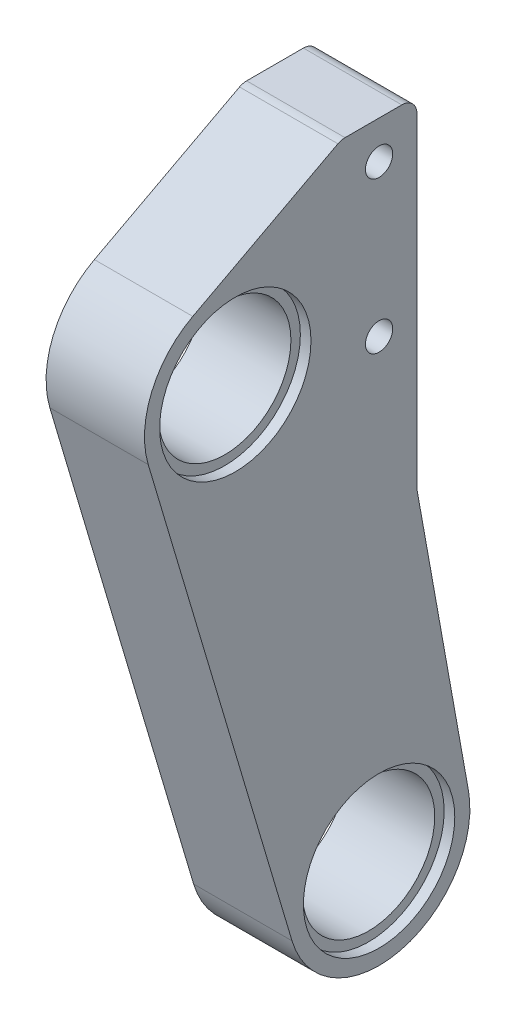
ISO-10303-21;
HEADER;
FILE_DESCRIPTION(('STEP AP214'),'2;1');
FILE_NAME('part.step','',(''),(''),'','','');
FILE_SCHEMA(('AUTOMOTIVE_DESIGN { 1 0 10303 214 1 1 1 1 }'));
ENDSEC;
DATA;
#1=APPLICATION_CONTEXT('core data for automotive mechanical design processes');
#2=APPLICATION_PROTOCOL_DEFINITION('international standard','automotive_design',2000,#1);
#3=PRODUCT_CONTEXT('',#1,'mechanical');
#4=PRODUCT('Part','Part','',(#3));
#5=PRODUCT_RELATED_PRODUCT_CATEGORY('part','',(#4));
#6=PRODUCT_DEFINITION_FORMATION('','',#4);
#7=PRODUCT_DEFINITION_CONTEXT('part definition',#1,'design');
#8=PRODUCT_DEFINITION('design','',#6,#7);
#9=PRODUCT_DEFINITION_SHAPE('','',#8);
#10=(LENGTH_UNIT() NAMED_UNIT(*) SI_UNIT(.MILLI.,.METRE.));
#11=(NAMED_UNIT(*) PLANE_ANGLE_UNIT() SI_UNIT($,.RADIAN.));
#12=(NAMED_UNIT(*) SI_UNIT($,.STERADIAN.) SOLID_ANGLE_UNIT());
#13=UNCERTAINTY_MEASURE_WITH_UNIT(LENGTH_MEASURE(1.E-05),#10,'distance_accuracy_value','');
#14=(GEOMETRIC_REPRESENTATION_CONTEXT(3) GLOBAL_UNCERTAINTY_ASSIGNED_CONTEXT((#13)) GLOBAL_UNIT_ASSIGNED_CONTEXT((#10,
#11,#12)) REPRESENTATION_CONTEXT('',''));
#15=CARTESIAN_POINT('',(0.,0.,0.));
#16=DIRECTION('',(0.,0.,1.));
#17=DIRECTION('',(1.,0.,0.));
#18=AXIS2_PLACEMENT_3D('',#15,#16,#17);
#19=CARTESIAN_POINT('',(16.51,5.08000000000002,24.13));
#20=DIRECTION('',(-1.,0.,0.));
#21=DIRECTION('',(0.,0.,1.));
#22=AXIS2_PLACEMENT_3D('',#19,#20,#21);
#23=CYLINDRICAL_SURFACE('',#22,11.1125);
#24=CARTESIAN_POINT('',(0.,5.08000000000002,24.13));
#25=DIRECTION('',(1.,0.,0.));
#26=DIRECTION('',(0.,0.,-1.));
#27=AXIS2_PLACEMENT_3D('',#24,#25,#26);
#28=CIRCLE('',#27,11.1125);
#29=CARTESIAN_POINT('',(0.,5.08000000000002,13.0175));
#30=VERTEX_POINT('',#29);
#31=EDGE_CURVE('E212',#30,#30,#28,.T.);
#32=ORIENTED_EDGE('',*,*,#31,.F.);
#33=EDGE_LOOP('',(#32));
#34=FACE_BOUND('',#33,.T.);
#35=CARTESIAN_POINT('',(14.732,5.08000000000002,24.13));
#36=DIRECTION('',(1.,0.,0.));
#37=DIRECTION('',(0.,0.,-1.));
#38=AXIS2_PLACEMENT_3D('',#35,#36,#37);
#39=CIRCLE('',#38,11.1125);
#40=CARTESIAN_POINT('',(14.732,5.08000000000002,13.0175));
#41=VERTEX_POINT('',#40);
#42=EDGE_CURVE('E148',#41,#41,#39,.T.);
#43=ORIENTED_EDGE('',*,*,#42,.T.);
#44=EDGE_LOOP('',(#43));
#45=FACE_BOUND('',#44,.T.);
#46=ADVANCED_FACE('F35',(#34,#45),#23,.F.);
#47=CARTESIAN_POINT('',(16.51,-76.2,0.));
#48=DIRECTION('',(-1.,0.,0.));
#49=DIRECTION('',(0.,0.,1.));
#50=AXIS2_PLACEMENT_3D('',#47,#48,#49);
#51=CYLINDRICAL_SURFACE('',#50,11.1125);
#52=CARTESIAN_POINT('',(0.,-76.2,0.));
#53=DIRECTION('',(1.,0.,0.));
#54=DIRECTION('',(0.,0.,-1.));
#55=AXIS2_PLACEMENT_3D('',#52,#53,#54);
#56=CIRCLE('',#55,11.1125);
#57=CARTESIAN_POINT('',(0.,-76.2,-11.1125));
#58=VERTEX_POINT('',#57);
#59=EDGE_CURVE('E209',#58,#58,#56,.T.);
#60=ORIENTED_EDGE('',*,*,#59,.F.);
#61=EDGE_LOOP('',(#60));
#62=FACE_BOUND('',#61,.T.);
#63=CARTESIAN_POINT('',(14.732,-76.2,0.));
#64=DIRECTION('',(1.,0.,0.));
#65=DIRECTION('',(0.,0.,-1.));
#66=AXIS2_PLACEMENT_3D('',#63,#64,#65);
#67=CIRCLE('',#66,11.1125);
#68=CARTESIAN_POINT('',(14.732,-76.2,-11.1125));
#69=VERTEX_POINT('',#68);
#70=EDGE_CURVE('E145',#69,#69,#67,.T.);
#71=ORIENTED_EDGE('',*,*,#70,.T.);
#72=EDGE_LOOP('',(#71));
#73=FACE_BOUND('',#72,.T.);
#74=ADVANCED_FACE('F289',(#62,#73),#51,.F.);
#75=CARTESIAN_POINT('',(16.51,27.415812969478,14.5286727979772));
#76=DIRECTION('',(0.,-0.883595677168671,-0.468250658610149));
#77=DIRECTION('',(0.,0.468250658610149,-0.883595677168671));
#78=AXIS2_PLACEMENT_3D('',#75,#76,#77);
#79=PLANE('',#78);
#80=DIRECTION('',(0.,-0.468250658610149,0.883595677168671));
#81=VECTOR('',#80,1.);
#82=CARTESIAN_POINT('',(16.51,27.415812969478,14.5286727979772));
#83=LINE('',#82,#81);
#84=CARTESIAN_POINT('',(16.51,31.4543330200084,6.90792781194907));
#85=VERTEX_POINT('',#84);
#86=CARTESIAN_POINT('',(16.51,18.5459981200506,31.2661400372187));
#87=VERTEX_POINT('',#86);
#88=EDGE_CURVE('E111',#85,#87,#83,.T.);
#89=ORIENTED_EDGE('',*,*,#88,.F.);
#90=DIRECTION('',(-1.,0.,0.));
#91=VECTOR('',#90,1.);
#92=CARTESIAN_POINT('',(0.,31.4543330200084,6.90792781194907));
#93=LINE('',#92,#91);
#94=CARTESIAN_POINT('',(0.,31.4543330200084,6.90792781194907));
#95=VERTEX_POINT('',#94);
#96=EDGE_CURVE('E157',#85,#95,#93,.T.);
#97=ORIENTED_EDGE('',*,*,#96,.T.);
#98=DIRECTION('',(0.,-0.468250658610149,0.883595677168671));
#99=VECTOR('',#98,1.);
#100=CARTESIAN_POINT('',(0.,27.415812969478,14.5286727979772));
#101=LINE('',#100,#99);
#102=CARTESIAN_POINT('',(0.,18.5459981200506,31.2661400372187));
#103=VERTEX_POINT('',#102);
#104=EDGE_CURVE('E135',#95,#103,#101,.T.);
#105=ORIENTED_EDGE('',*,*,#104,.T.);
#106=DIRECTION('',(-1.,0.,0.));
#107=VECTOR('',#106,1.);
#108=CARTESIAN_POINT('',(16.51,18.5459981200506,31.2661400372187));
#109=LINE('',#108,#107);
#110=EDGE_CURVE('E127',#87,#103,#109,.T.);
#111=ORIENTED_EDGE('',*,*,#110,.F.);
#112=EDGE_LOOP('',(#89,#97,#105,#111));
#113=FACE_BOUND('',#112,.T.);
#114=ADVANCED_FACE('F133',(#113),#79,.F.);
#115=CARTESIAN_POINT('',(16.51,5.08000000000002,24.13));
#116=DIRECTION('',(-1.,0.,0.));
#117=DIRECTION('',(0.,0.,1.));
#118=AXIS2_PLACEMENT_3D('',#115,#116,#117);
#119=CYLINDRICAL_SURFACE('',#118,15.24);
#120=CARTESIAN_POINT('',(0.,5.08000000000002,24.13));
#121=DIRECTION('',(1.,0.,0.));
#122=DIRECTION('',(0.,0.,-1.));
#123=AXIS2_PLACEMENT_3D('',#120,#121,#122);
#124=CIRCLE('',#123,15.24);
#125=CARTESIAN_POINT('',(0.,0.742722084383057,38.7397782420782));
#126=VERTEX_POINT('',#125);
#127=EDGE_CURVE('E216',#103,#126,#124,.T.);
#128=ORIENTED_EDGE('',*,*,#127,.T.);
#129=DIRECTION('',(-1.,0.,0.));
#130=VECTOR('',#129,1.);
#131=CARTESIAN_POINT('',(16.51,0.742722084383057,38.7397782420782));
#132=LINE('',#131,#130);
#133=CARTESIAN_POINT('',(16.51,0.742722084383057,38.7397782420782));
#134=VERTEX_POINT('',#133);
#135=EDGE_CURVE('E129',#134,#126,#132,.T.);
#136=ORIENTED_EDGE('',*,*,#135,.F.);
#137=CARTESIAN_POINT('',(16.51,5.08000000000002,24.13));
#138=DIRECTION('',(1.,0.,0.));
#139=DIRECTION('',(0.,0.,-1.));
#140=AXIS2_PLACEMENT_3D('',#137,#138,#139);
#141=CIRCLE('',#140,15.24);
#142=EDGE_CURVE('E114',#87,#134,#141,.T.);
#143=ORIENTED_EDGE('',*,*,#142,.F.);
#144=ORIENTED_EDGE('',*,*,#110,.T.);
#145=EDGE_LOOP('',(#128,#136,#143,#144));
#146=FACE_BOUND('',#145,.T.);
#147=ADVANCED_FACE('F126',(#146),#119,.T.);
#148=CARTESIAN_POINT('',(16.51,-10.5091872716861,35.3993676519952));
#149=DIRECTION('',(0.,0.28459828842631,-0.958646866278097));
#150=DIRECTION('',(0.,0.958646866278097,0.28459828842631));
#151=AXIS2_PLACEMENT_3D('',#148,#149,#150);
#152=PLANE('',#151);
#153=DIRECTION('',(0.,-0.958646866278097,-0.28459828842631));
#154=VECTOR('',#153,1.);
#155=CARTESIAN_POINT('',(0.,-10.5091872716861,35.3993676519952));
#156=LINE('',#155,#154);
#157=CARTESIAN_POINT('',(0.,-80.537277915617,14.6097782420782));
#158=VERTEX_POINT('',#157);
#159=EDGE_CURVE('E218',#126,#158,#156,.T.);
#160=ORIENTED_EDGE('',*,*,#159,.T.);
#161=DIRECTION('',(-1.,0.,0.));
#162=VECTOR('',#161,1.);
#163=CARTESIAN_POINT('',(16.51,-80.537277915617,14.6097782420782));
#164=LINE('',#163,#162);
#165=CARTESIAN_POINT('',(16.51,-80.537277915617,14.6097782420782));
#166=VERTEX_POINT('',#165);
#167=EDGE_CURVE('E141',#166,#158,#164,.T.);
#168=ORIENTED_EDGE('',*,*,#167,.F.);
#169=DIRECTION('',(0.,-0.958646866278097,-0.28459828842631));
#170=VECTOR('',#169,1.);
#171=CARTESIAN_POINT('',(16.51,-10.5091872716861,35.3993676519952));
#172=LINE('',#171,#170);
#173=EDGE_CURVE('E131',#134,#166,#172,.T.);
#174=ORIENTED_EDGE('',*,*,#173,.F.);
#175=ORIENTED_EDGE('',*,*,#135,.T.);
#176=EDGE_LOOP('',(#160,#168,#174,#175));
#177=FACE_BOUND('',#176,.T.);
#178=ADVANCED_FACE('F233',(#177),#152,.F.);
#179=CARTESIAN_POINT('',(16.51,-76.2,0.));
#180=DIRECTION('',(-1.,0.,0.));
#181=DIRECTION('',(0.,0.,1.));
#182=AXIS2_PLACEMENT_3D('',#179,#180,#181);
#183=CYLINDRICAL_SURFACE('',#182,15.24);
#184=CARTESIAN_POINT('',(0.,-76.2,0.));
#185=DIRECTION('',(1.,0.,0.));
#186=DIRECTION('',(0.,0.,-1.));
#187=AXIS2_PLACEMENT_3D('',#184,#185,#186);
#188=CIRCLE('',#187,15.24);
#189=CARTESIAN_POINT('',(0.,-73.5029309083728,-14.9994472669825));
#190=VERTEX_POINT('',#189);
#191=EDGE_CURVE('E187',#158,#190,#188,.T.);
#192=ORIENTED_EDGE('',*,*,#191,.T.);
#193=DIRECTION('',(-1.,0.,0.));
#194=VECTOR('',#193,1.);
#195=CARTESIAN_POINT('',(16.51,-73.5029309083728,-14.9994472669825));
#196=LINE('',#195,#194);
#197=CARTESIAN_POINT('',(16.51,-73.5029309083728,-14.9994472669825));
#198=VERTEX_POINT('',#197);
#199=EDGE_CURVE('E186',#198,#190,#196,.T.);
#200=ORIENTED_EDGE('',*,*,#199,.F.);
#201=CARTESIAN_POINT('',(16.51,-76.2,0.));
#202=DIRECTION('',(1.,0.,0.));
#203=DIRECTION('',(0.,0.,-1.));
#204=AXIS2_PLACEMENT_3D('',#201,#202,#203);
#205=CIRCLE('',#204,15.24);
#206=EDGE_CURVE('E200',#166,#198,#205,.T.);
#207=ORIENTED_EDGE('',*,*,#206,.F.);
#208=ORIENTED_EDGE('',*,*,#167,.T.);
#209=EDGE_LOOP('',(#192,#200,#207,#208));
#210=FACE_BOUND('',#209,.T.);
#211=ADVANCED_FACE('F230',(#210),#183,.T.);
#212=CARTESIAN_POINT('',(16.51,0.3105265440515,-1.72695854806179));
#213=DIRECTION('',(0.,-0.176973037508345,0.984215699933236));
#214=DIRECTION('',(0.,-0.984215699933236,-0.176973037508345));
#215=AXIS2_PLACEMENT_3D('',#212,#213,#214);
#216=PLANE('',#215);
#217=DIRECTION('',(0.,0.984215699933236,0.176973037508345));
#218=VECTOR('',#217,1.);
#219=CARTESIAN_POINT('',(0.,0.3105265440515,-1.72695854806179));
#220=LINE('',#219,#218);
#221=CARTESIAN_POINT('',(0.,-25.6229678409689,-6.39009212216958));
#222=VERTEX_POINT('',#221);
#223=EDGE_CURVE('E174',#190,#222,#220,.T.);
#224=ORIENTED_EDGE('',*,*,#223,.T.);
#225=DIRECTION('',(-1.,0.,0.));
#226=VECTOR('',#225,1.);
#227=CARTESIAN_POINT('',(16.51,-25.6229678409689,-6.39009212216958));
#228=LINE('',#227,#226);
#229=CARTESIAN_POINT('',(16.51,-25.6229678409689,-6.39009212216958));
#230=VERTEX_POINT('',#229);
#231=EDGE_CURVE('E155',#222,#230,#228,.F.);
#232=ORIENTED_EDGE('',*,*,#231,.T.);
#233=DIRECTION('',(0.,0.984215699933236,0.176973037508345));
#234=VECTOR('',#233,1.);
#235=CARTESIAN_POINT('',(16.51,0.3105265440515,-1.72695854806179));
#236=LINE('',#235,#234);
#237=EDGE_CURVE('E193',#198,#230,#236,.T.);
#238=ORIENTED_EDGE('',*,*,#237,.F.);
#239=ORIENTED_EDGE('',*,*,#199,.T.);
#240=EDGE_LOOP('',(#224,#232,#238,#239));
#241=FACE_BOUND('',#240,.T.);
#242=ADVANCED_FACE('F182',(#241),#216,.F.);
#243=CARTESIAN_POINT('',(16.51,0.,-6.35));
#244=DIRECTION('',(0.,0.,1.));
#245=DIRECTION('',(1.,0.,0.));
#246=AXIS2_PLACEMENT_3D('',#243,#244,#245);
#247=PLANE('',#246);
#248=DIRECTION('',(0.,1.,0.));
#249=VECTOR('',#248,1.);
#250=CARTESIAN_POINT('',(16.51,0.,-6.35));
#251=LINE('',#250,#249);
#252=CARTESIAN_POINT('',(16.51,-25.1734563256977,-6.35));
#253=VERTEX_POINT('',#252);
#254=CARTESIAN_POINT('',(16.51,29.21,-6.35));
#255=VERTEX_POINT('',#254);
#256=EDGE_CURVE('E192',#253,#255,#251,.T.);
#257=ORIENTED_EDGE('',*,*,#256,.F.);
#258=DIRECTION('',(-1.,0.,0.));
#259=VECTOR('',#258,1.);
#260=CARTESIAN_POINT('',(0.,-25.1734563256977,-6.35));
#261=LINE('',#260,#259);
#262=CARTESIAN_POINT('',(0.,-25.1734563256977,-6.35));
#263=VERTEX_POINT('',#262);
#264=EDGE_CURVE('E139',#253,#263,#261,.T.);
#265=ORIENTED_EDGE('',*,*,#264,.T.);
#266=DIRECTION('',(0.,1.,0.));
#267=VECTOR('',#266,1.);
#268=CARTESIAN_POINT('',(0.,0.,-6.35));
#269=LINE('',#268,#267);
#270=CARTESIAN_POINT('',(0.,29.21,-6.35));
#271=VERTEX_POINT('',#270);
#272=EDGE_CURVE('E176',#263,#271,#269,.T.);
#273=ORIENTED_EDGE('',*,*,#272,.T.);
#274=DIRECTION('',(-1.,0.,0.));
#275=VECTOR('',#274,1.);
#276=CARTESIAN_POINT('',(16.51,29.21,-6.35));
#277=LINE('',#276,#275);
#278=EDGE_CURVE('E137',#271,#255,#277,.F.);
#279=ORIENTED_EDGE('',*,*,#278,.T.);
#280=EDGE_LOOP('',(#257,#265,#273,#279));
#281=FACE_BOUND('',#280,.T.);
#282=ADVANCED_FACE('F195',(#281),#247,.F.);
#283=CARTESIAN_POINT('',(16.51,25.4,0.));
#284=DIRECTION('',(-1.,0.,0.));
#285=DIRECTION('',(0.,0.,1.));
#286=AXIS2_PLACEMENT_3D('',#283,#284,#285);
#287=CYLINDRICAL_SURFACE('',#286,2.286);
#288=CARTESIAN_POINT('',(16.51,25.4,0.));
#289=DIRECTION('',(1.,0.,0.));
#290=DIRECTION('',(0.,0.,-1.));
#291=AXIS2_PLACEMENT_3D('',#288,#289,#290);
#292=CIRCLE('',#291,2.286);
#293=CARTESIAN_POINT('',(16.51,25.4,-2.286));
#294=VERTEX_POINT('',#293);
#295=EDGE_CURVE('E122',#294,#294,#292,.T.);
#296=ORIENTED_EDGE('',*,*,#295,.T.);
#297=EDGE_LOOP('',(#296));
#298=FACE_BOUND('',#297,.T.);
#299=CARTESIAN_POINT('',(0.,25.4,0.));
#300=DIRECTION('',(1.,0.,0.));
#301=DIRECTION('',(0.,0.,-1.));
#302=AXIS2_PLACEMENT_3D('',#299,#300,#301);
#303=CIRCLE('',#302,2.286);
#304=CARTESIAN_POINT('',(0.,25.4,-2.286));
#305=VERTEX_POINT('',#304);
#306=EDGE_CURVE('E206',#305,#305,#303,.T.);
#307=ORIENTED_EDGE('',*,*,#306,.F.);
#308=EDGE_LOOP('',(#307));
#309=FACE_BOUND('',#308,.T.);
#310=ADVANCED_FACE('F271',(#298,#309),#287,.F.);
#311=CARTESIAN_POINT('',(16.51,0.,0.));
#312=DIRECTION('',(-1.,0.,0.));
#313=DIRECTION('',(0.,0.,1.));
#314=AXIS2_PLACEMENT_3D('',#311,#312,#313);
#315=CYLINDRICAL_SURFACE('',#314,2.286);
#316=CARTESIAN_POINT('',(16.51,0.,0.));
#317=DIRECTION('',(1.,0.,0.));
#318=DIRECTION('',(0.,0.,-1.));
#319=AXIS2_PLACEMENT_3D('',#316,#317,#318);
#320=CIRCLE('',#319,2.286);
#321=CARTESIAN_POINT('',(16.51,0.,-2.286));
#322=VERTEX_POINT('',#321);
#323=EDGE_CURVE('E225',#322,#322,#320,.T.);
#324=ORIENTED_EDGE('',*,*,#323,.T.);
#325=EDGE_LOOP('',(#324));
#326=FACE_BOUND('',#325,.T.);
#327=CARTESIAN_POINT('',(0.,0.,0.));
#328=DIRECTION('',(1.,0.,0.));
#329=DIRECTION('',(0.,0.,-1.));
#330=AXIS2_PLACEMENT_3D('',#327,#328,#329);
#331=CIRCLE('',#330,2.286);
#332=CARTESIAN_POINT('',(0.,0.,-2.286));
#333=VERTEX_POINT('',#332);
#334=EDGE_CURVE('E151',#333,#333,#331,.T.);
#335=ORIENTED_EDGE('',*,*,#334,.F.);
#336=EDGE_LOOP('',(#335));
#337=FACE_BOUND('',#336,.T.);
#338=ADVANCED_FACE('F274',(#326,#337),#315,.F.);
#339=CARTESIAN_POINT('',(16.51,31.75,0.));
#340=DIRECTION('',(0.,1.,0.));
#341=DIRECTION('',(0.,0.,1.));
#342=AXIS2_PLACEMENT_3D('',#339,#340,#341);
#343=PLANE('',#342);
#344=DIRECTION('',(0.,0.,-1.));
#345=VECTOR('',#344,1.);
#346=CARTESIAN_POINT('',(0.,31.75,0.));
#347=LINE('',#346,#345);
#348=CARTESIAN_POINT('',(0.,31.75,5.71857113907929));
#349=VERTEX_POINT('',#348);
#350=CARTESIAN_POINT('',(0.,31.75,-3.81));
#351=VERTEX_POINT('',#350);
#352=EDGE_CURVE('E222',#349,#351,#347,.T.);
#353=ORIENTED_EDGE('',*,*,#352,.F.);
#354=DIRECTION('',(-1.,0.,0.));
#355=VECTOR('',#354,1.);
#356=CARTESIAN_POINT('',(16.51,31.75,5.71857113907929));
#357=LINE('',#356,#355);
#358=CARTESIAN_POINT('',(16.51,31.75,5.71857113907929));
#359=VERTEX_POINT('',#358);
#360=EDGE_CURVE('E57',#349,#359,#357,.F.);
#361=ORIENTED_EDGE('',*,*,#360,.T.);
#362=DIRECTION('',(0.,0.,-1.));
#363=VECTOR('',#362,1.);
#364=CARTESIAN_POINT('',(16.51,31.75,0.));
#365=LINE('',#364,#363);
#366=CARTESIAN_POINT('',(16.51,31.75,-3.81));
#367=VERTEX_POINT('',#366);
#368=EDGE_CURVE('E197',#359,#367,#365,.T.);
#369=ORIENTED_EDGE('',*,*,#368,.T.);
#370=DIRECTION('',(-1.,0.,0.));
#371=VECTOR('',#370,1.);
#372=CARTESIAN_POINT('',(0.,31.75,-3.81));
#373=LINE('',#372,#371);
#374=EDGE_CURVE('E163',#367,#351,#373,.T.);
#375=ORIENTED_EDGE('',*,*,#374,.T.);
#376=EDGE_LOOP('',(#353,#361,#369,#375));
#377=FACE_BOUND('',#376,.T.);
#378=ADVANCED_FACE('F263',(#377),#343,.T.);
#379=CARTESIAN_POINT('',(16.51,0.,0.));
#380=DIRECTION('',(1.,0.,0.));
#381=DIRECTION('',(0.,0.,-1.));
#382=AXIS2_PLACEMENT_3D('',#379,#380,#381);
#383=PLANE('',#382);
#384=CARTESIAN_POINT('',(16.51,-76.2,0.));
#385=DIRECTION('',(1.,0.,0.));
#386=DIRECTION('',(0.,0.,-1.));
#387=AXIS2_PLACEMENT_3D('',#384,#385,#386);
#388=CIRCLE('',#387,12.7);
#389=CARTESIAN_POINT('',(16.51,-76.2,-12.7));
#390=VERTEX_POINT('',#389);
#391=EDGE_CURVE('E246',#390,#390,#388,.T.);
#392=ORIENTED_EDGE('',*,*,#391,.F.);
#393=EDGE_LOOP('',(#392));
#394=FACE_BOUND('',#393,.T.);
#395=CARTESIAN_POINT('',(16.51,5.08000000000002,24.13));
#396=DIRECTION('',(1.,0.,0.));
#397=DIRECTION('',(0.,0.,-1.));
#398=AXIS2_PLACEMENT_3D('',#395,#396,#397);
#399=CIRCLE('',#398,12.7);
#400=CARTESIAN_POINT('',(16.51,5.08000000000002,11.43));
#401=VERTEX_POINT('',#400);
#402=EDGE_CURVE('E240',#401,#401,#399,.T.);
#403=ORIENTED_EDGE('',*,*,#402,.F.);
#404=EDGE_LOOP('',(#403));
#405=FACE_BOUND('',#404,.T.);
#406=ORIENTED_EDGE('',*,*,#323,.F.);
#407=EDGE_LOOP('',(#406));
#408=FACE_BOUND('',#407,.T.);
#409=ORIENTED_EDGE('',*,*,#295,.F.);
#410=EDGE_LOOP('',(#409));
#411=FACE_BOUND('',#410,.T.);
#412=ORIENTED_EDGE('',*,*,#368,.F.);
#413=CARTESIAN_POINT('',(16.51,29.21,5.71857113907929));
#414=DIRECTION('',(1.,0.,0.));
#415=DIRECTION('',(0.,0.,-1.));
#416=AXIS2_PLACEMENT_3D('',#413,#414,#415);
#417=CIRCLE('',#416,2.54);
#418=EDGE_CURVE('E117',#359,#85,#417,.T.);
#419=ORIENTED_EDGE('',*,*,#418,.T.);
#420=ORIENTED_EDGE('',*,*,#88,.T.);
#421=ORIENTED_EDGE('',*,*,#142,.T.);
#422=ORIENTED_EDGE('',*,*,#173,.T.);
#423=ORIENTED_EDGE('',*,*,#206,.T.);
#424=ORIENTED_EDGE('',*,*,#237,.T.);
#425=CARTESIAN_POINT('',(16.51,-25.1734563256977,-8.89));
#426=DIRECTION('',(1.,0.,0.));
#427=DIRECTION('',(0.,0.,-1.));
#428=AXIS2_PLACEMENT_3D('',#425,#426,#427);
#429=CIRCLE('',#428,2.54);
#430=EDGE_CURVE('E11',#230,#253,#429,.F.);
#431=ORIENTED_EDGE('',*,*,#430,.T.);
#432=ORIENTED_EDGE('',*,*,#256,.T.);
#433=CARTESIAN_POINT('',(16.51,29.21,-3.81));
#434=DIRECTION('',(1.,0.,0.));
#435=DIRECTION('',(0.,0.,-1.));
#436=AXIS2_PLACEMENT_3D('',#433,#434,#435);
#437=CIRCLE('',#436,2.54);
#438=EDGE_CURVE('E50',#255,#367,#437,.T.);
#439=ORIENTED_EDGE('',*,*,#438,.T.);
#440=EDGE_LOOP('',(#412,#419,#420,#421,#422,#423,#424,#431,#432,#439));
#441=FACE_BOUND('',#440,.T.);
#442=ADVANCED_FACE('F113',(#394,#405,#408,#411,#441),#383,.T.);
#443=CARTESIAN_POINT('',(0.,0.,0.));
#444=DIRECTION('',(1.,0.,0.));
#445=DIRECTION('',(0.,0.,-1.));
#446=AXIS2_PLACEMENT_3D('',#443,#444,#445);
#447=PLANE('',#446);
#448=ORIENTED_EDGE('',*,*,#334,.T.);
#449=EDGE_LOOP('',(#448));
#450=FACE_BOUND('',#449,.T.);
#451=ORIENTED_EDGE('',*,*,#306,.T.);
#452=EDGE_LOOP('',(#451));
#453=FACE_BOUND('',#452,.T.);
#454=ORIENTED_EDGE('',*,*,#59,.T.);
#455=EDGE_LOOP('',(#454));
#456=FACE_BOUND('',#455,.T.);
#457=ORIENTED_EDGE('',*,*,#31,.T.);
#458=EDGE_LOOP('',(#457));
#459=FACE_BOUND('',#458,.T.);
#460=ORIENTED_EDGE('',*,*,#104,.F.);
#461=CARTESIAN_POINT('',(0.,29.21,5.71857113907929));
#462=DIRECTION('',(1.,0.,0.));
#463=DIRECTION('',(0.,0.,-1.));
#464=AXIS2_PLACEMENT_3D('',#461,#462,#463);
#465=CIRCLE('',#464,2.54);
#466=EDGE_CURVE('E161',#95,#349,#465,.F.);
#467=ORIENTED_EDGE('',*,*,#466,.T.);
#468=ORIENTED_EDGE('',*,*,#352,.T.);
#469=CARTESIAN_POINT('',(0.,29.21,-3.81));
#470=DIRECTION('',(1.,0.,0.));
#471=DIRECTION('',(0.,0.,-1.));
#472=AXIS2_PLACEMENT_3D('',#469,#470,#471);
#473=CIRCLE('',#472,2.54);
#474=EDGE_CURVE('E159',#351,#271,#473,.F.);
#475=ORIENTED_EDGE('',*,*,#474,.T.);
#476=ORIENTED_EDGE('',*,*,#272,.F.);
#477=CARTESIAN_POINT('',(0.,-25.1734563256977,-8.89));
#478=DIRECTION('',(1.,0.,0.));
#479=DIRECTION('',(0.,0.,-1.));
#480=AXIS2_PLACEMENT_3D('',#477,#478,#479);
#481=CIRCLE('',#480,2.54);
#482=EDGE_CURVE('E43',#263,#222,#481,.T.);
#483=ORIENTED_EDGE('',*,*,#482,.T.);
#484=ORIENTED_EDGE('',*,*,#223,.F.);
#485=ORIENTED_EDGE('',*,*,#191,.F.);
#486=ORIENTED_EDGE('',*,*,#159,.F.);
#487=ORIENTED_EDGE('',*,*,#127,.F.);
#488=EDGE_LOOP('',(#460,#467,#468,#475,#476,#483,#484,#485,#486,#487));
#489=FACE_BOUND('',#488,.T.);
#490=ADVANCED_FACE('F172',(#450,#453,#456,#459,#489),#447,.F.);
#491=CARTESIAN_POINT('',(14.732,5.08000000000002,24.13));
#492=DIRECTION('',(1.,0.,0.));
#493=DIRECTION('',(0.,0.,-1.));
#494=AXIS2_PLACEMENT_3D('',#491,#492,#493);
#495=CYLINDRICAL_SURFACE('',#494,12.7);
#496=CARTESIAN_POINT('',(14.732,5.08000000000002,24.13));
#497=DIRECTION('',(1.,0.,0.));
#498=DIRECTION('',(0.,0.,-1.));
#499=AXIS2_PLACEMENT_3D('',#496,#497,#498);
#500=CIRCLE('',#499,12.7);
#501=CARTESIAN_POINT('',(14.732,5.08000000000002,11.43));
#502=VERTEX_POINT('',#501);
#503=EDGE_CURVE('E243',#502,#502,#500,.T.);
#504=ORIENTED_EDGE('',*,*,#503,.F.);
#505=EDGE_LOOP('',(#504));
#506=FACE_BOUND('',#505,.T.);
#507=ORIENTED_EDGE('',*,*,#402,.T.);
#508=EDGE_LOOP('',(#507));
#509=FACE_BOUND('',#508,.T.);
#510=ADVANCED_FACE('F280',(#506,#509),#495,.F.);
#511=CARTESIAN_POINT('',(14.732,5.08000000000002,24.13));
#512=DIRECTION('',(1.,0.,0.));
#513=DIRECTION('',(0.,0.,-1.));
#514=AXIS2_PLACEMENT_3D('',#511,#512,#513);
#515=PLANE('',#514);
#516=ORIENTED_EDGE('',*,*,#42,.F.);
#517=EDGE_LOOP('',(#516));
#518=FACE_BOUND('',#517,.T.);
#519=ORIENTED_EDGE('',*,*,#503,.T.);
#520=EDGE_LOOP('',(#519));
#521=FACE_BOUND('',#520,.T.);
#522=ADVANCED_FACE('F257',(#518,#521),#515,.T.);
#523=CARTESIAN_POINT('',(14.732,-76.2,0.));
#524=DIRECTION('',(1.,0.,0.));
#525=DIRECTION('',(0.,0.,-1.));
#526=AXIS2_PLACEMENT_3D('',#523,#524,#525);
#527=CYLINDRICAL_SURFACE('',#526,12.7);
#528=CARTESIAN_POINT('',(14.732,-76.2,0.));
#529=DIRECTION('',(1.,0.,0.));
#530=DIRECTION('',(0.,0.,-1.));
#531=AXIS2_PLACEMENT_3D('',#528,#529,#530);
#532=CIRCLE('',#531,12.7);
#533=CARTESIAN_POINT('',(14.732,-76.2,-12.7));
#534=VERTEX_POINT('',#533);
#535=EDGE_CURVE('E149',#534,#534,#532,.T.);
#536=ORIENTED_EDGE('',*,*,#535,.F.);
#537=EDGE_LOOP('',(#536));
#538=FACE_BOUND('',#537,.T.);
#539=ORIENTED_EDGE('',*,*,#391,.T.);
#540=EDGE_LOOP('',(#539));
#541=FACE_BOUND('',#540,.T.);
#542=ADVANCED_FACE('F254',(#538,#541),#527,.F.);
#543=CARTESIAN_POINT('',(14.732,-76.2,0.));
#544=DIRECTION('',(1.,0.,0.));
#545=DIRECTION('',(0.,0.,-1.));
#546=AXIS2_PLACEMENT_3D('',#543,#544,#545);
#547=PLANE('',#546);
#548=ORIENTED_EDGE('',*,*,#70,.F.);
#549=EDGE_LOOP('',(#548));
#550=FACE_BOUND('',#549,.T.);
#551=ORIENTED_EDGE('',*,*,#535,.T.);
#552=EDGE_LOOP('',(#551));
#553=FACE_BOUND('',#552,.T.);
#554=ADVANCED_FACE('F252',(#550,#553),#547,.T.);
#555=CARTESIAN_POINT('',(16.51,-25.1734563256977,-8.89));
#556=DIRECTION('',(1.,0.,0.));
#557=DIRECTION('',(0.,0.,-1.));
#558=AXIS2_PLACEMENT_3D('',#555,#556,#557);
#559=CYLINDRICAL_SURFACE('',#558,2.54);
#560=ORIENTED_EDGE('',*,*,#430,.F.);
#561=ORIENTED_EDGE('',*,*,#231,.F.);
#562=ORIENTED_EDGE('',*,*,#482,.F.);
#563=ORIENTED_EDGE('',*,*,#264,.F.);
#564=EDGE_LOOP('',(#560,#561,#562,#563));
#565=FACE_BOUND('',#564,.T.);
#566=ADVANCED_FACE('F190',(#565),#559,.F.);
#567=CARTESIAN_POINT('',(16.51,29.21,5.71857113907929));
#568=DIRECTION('',(1.,0.,0.));
#569=DIRECTION('',(0.,0.,-1.));
#570=AXIS2_PLACEMENT_3D('',#567,#568,#569);
#571=CYLINDRICAL_SURFACE('',#570,2.54);
#572=ORIENTED_EDGE('',*,*,#418,.F.);
#573=ORIENTED_EDGE('',*,*,#360,.F.);
#574=ORIENTED_EDGE('',*,*,#466,.F.);
#575=ORIENTED_EDGE('',*,*,#96,.F.);
#576=EDGE_LOOP('',(#572,#573,#574,#575));
#577=FACE_BOUND('',#576,.T.);
#578=ADVANCED_FACE('F325',(#577),#571,.T.);
#579=CARTESIAN_POINT('',(16.51,29.21,-3.81));
#580=DIRECTION('',(1.,0.,0.));
#581=DIRECTION('',(0.,0.,-1.));
#582=AXIS2_PLACEMENT_3D('',#579,#580,#581);
#583=CYLINDRICAL_SURFACE('',#582,2.54);
#584=ORIENTED_EDGE('',*,*,#438,.F.);
#585=ORIENTED_EDGE('',*,*,#278,.F.);
#586=ORIENTED_EDGE('',*,*,#474,.F.);
#587=ORIENTED_EDGE('',*,*,#374,.F.);
#588=EDGE_LOOP('',(#584,#585,#586,#587));
#589=FACE_BOUND('',#588,.T.);
#590=ADVANCED_FACE('F37',(#589),#583,.T.);
#591=CLOSED_SHELL('',(#46,#74,#114,#147,#178,#211,#242,#282,#310,#338,#378,#442,#490,#510,#522,
#542,#554,#566,#578,#590));
#592=MANIFOLD_SOLID_BREP('B2',#591);
#593=ADVANCED_BREP_SHAPE_REPRESENTATION('',(#18,#592),#14);
#594=SHAPE_DEFINITION_REPRESENTATION(#9,#593);
ENDSEC;
END-ISO-10303-21;
